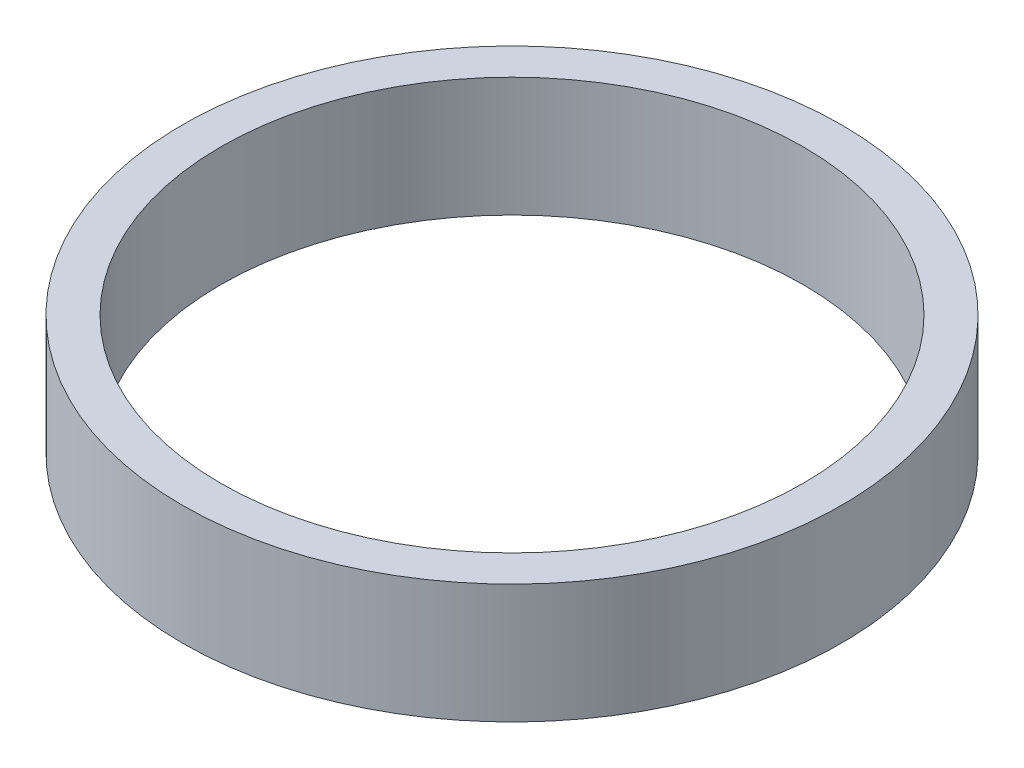
ISO-10303-21;
HEADER;
FILE_DESCRIPTION(('STEP AP214'),'2;1');
FILE_NAME('part.step','',(''),(''),'','','');
FILE_SCHEMA(('AUTOMOTIVE_DESIGN { 1 0 10303 214 1 1 1 1 }'));
ENDSEC;
DATA;
#1=APPLICATION_CONTEXT('core data for automotive mechanical design processes');
#2=APPLICATION_PROTOCOL_DEFINITION('international standard','automotive_design',2000,#1);
#3=PRODUCT_CONTEXT('',#1,'mechanical');
#4=PRODUCT('Part','Part','',(#3));
#5=PRODUCT_RELATED_PRODUCT_CATEGORY('part','',(#4));
#6=PRODUCT_DEFINITION_FORMATION('','',#4);
#7=PRODUCT_DEFINITION_CONTEXT('part definition',#1,'design');
#8=PRODUCT_DEFINITION('design','',#6,#7);
#9=PRODUCT_DEFINITION_SHAPE('','',#8);
#10=(LENGTH_UNIT() NAMED_UNIT(*) SI_UNIT(.MILLI.,.METRE.));
#11=(NAMED_UNIT(*) PLANE_ANGLE_UNIT() SI_UNIT($,.RADIAN.));
#12=(NAMED_UNIT(*) SI_UNIT($,.STERADIAN.) SOLID_ANGLE_UNIT());
#13=UNCERTAINTY_MEASURE_WITH_UNIT(LENGTH_MEASURE(1.E-05),#10,'distance_accuracy_value','');
#14=(GEOMETRIC_REPRESENTATION_CONTEXT(3) GLOBAL_UNCERTAINTY_ASSIGNED_CONTEXT((#13)) GLOBAL_UNIT_ASSIGNED_CONTEXT((#10,
#11,#12)) REPRESENTATION_CONTEXT('',''));
#15=CARTESIAN_POINT('',(0.,0.,0.));
#16=DIRECTION('',(0.,0.,1.));
#17=DIRECTION('',(1.,0.,0.));
#18=AXIS2_PLACEMENT_3D('',#15,#16,#17);
#19=CARTESIAN_POINT('',(0.,12.5,0.));
#20=DIRECTION('',(0.,1.,0.));
#21=DIRECTION('',(0.,0.,1.));
#22=AXIS2_PLACEMENT_3D('',#19,#20,#21);
#23=PLANE('',#22);
#24=CARTESIAN_POINT('',(0.,12.5,0.));
#25=DIRECTION('',(0.,1.,0.));
#26=DIRECTION('',(0.,0.,1.));
#27=AXIS2_PLACEMENT_3D('',#24,#25,#26);
#28=CIRCLE('',#27,34.5);
#29=CARTESIAN_POINT('',(0.,12.5,34.5));
#30=VERTEX_POINT('',#29);
#31=EDGE_CURVE('E10',#30,#30,#28,.T.);
#32=ORIENTED_EDGE('',*,*,#31,.T.);
#33=EDGE_LOOP('',(#32));
#34=FACE_BOUND('',#33,.T.);
#35=CARTESIAN_POINT('',(0.,12.5,0.));
#36=DIRECTION('',(0.,1.,0.));
#37=DIRECTION('',(0.,0.,1.));
#38=AXIS2_PLACEMENT_3D('',#35,#36,#37);
#39=CIRCLE('',#38,30.5);
#40=CARTESIAN_POINT('',(0.,12.5,30.5));
#41=VERTEX_POINT('',#40);
#42=EDGE_CURVE('E48',#41,#41,#39,.T.);
#43=ORIENTED_EDGE('',*,*,#42,.F.);
#44=EDGE_LOOP('',(#43));
#45=FACE_BOUND('',#44,.T.);
#46=ADVANCED_FACE('F37',(#34,#45),#23,.T.);
#47=CARTESIAN_POINT('',(0.,0.,0.));
#48=DIRECTION('',(0.,1.,0.));
#49=DIRECTION('',(0.,0.,1.));
#50=AXIS2_PLACEMENT_3D('',#47,#48,#49);
#51=PLANE('',#50);
#52=CARTESIAN_POINT('',(0.,0.,0.));
#53=DIRECTION('',(0.,1.,0.));
#54=DIRECTION('',(0.,0.,1.));
#55=AXIS2_PLACEMENT_3D('',#52,#53,#54);
#56=CIRCLE('',#55,34.5);
#57=CARTESIAN_POINT('',(0.,0.,34.5));
#58=VERTEX_POINT('',#57);
#59=EDGE_CURVE('E41',#58,#58,#56,.T.);
#60=ORIENTED_EDGE('',*,*,#59,.F.);
#61=EDGE_LOOP('',(#60));
#62=FACE_BOUND('',#61,.T.);
#63=CARTESIAN_POINT('',(0.,0.,0.));
#64=DIRECTION('',(0.,1.,0.));
#65=DIRECTION('',(0.,0.,1.));
#66=AXIS2_PLACEMENT_3D('',#63,#64,#65);
#67=CIRCLE('',#66,30.5);
#68=CARTESIAN_POINT('',(0.,0.,30.5));
#69=VERTEX_POINT('',#68);
#70=EDGE_CURVE('E50',#69,#69,#67,.T.);
#71=ORIENTED_EDGE('',*,*,#70,.T.);
#72=EDGE_LOOP('',(#71));
#73=FACE_BOUND('',#72,.T.);
#74=ADVANCED_FACE('F60',(#62,#73),#51,.F.);
#75=CARTESIAN_POINT('',(0.,12.5,0.));
#76=DIRECTION('',(0.,-1.,0.));
#77=DIRECTION('',(0.,0.,-1.));
#78=AXIS2_PLACEMENT_3D('',#75,#76,#77);
#79=CYLINDRICAL_SURFACE('',#78,34.5);
#80=ORIENTED_EDGE('',*,*,#31,.F.);
#81=EDGE_LOOP('',(#80));
#82=FACE_BOUND('',#81,.T.);
#83=ORIENTED_EDGE('',*,*,#59,.T.);
#84=EDGE_LOOP('',(#83));
#85=FACE_BOUND('',#84,.T.);
#86=ADVANCED_FACE('F39',(#82,#85),#79,.T.);
#87=CARTESIAN_POINT('',(0.,12.5,0.));
#88=DIRECTION('',(0.,-1.,0.));
#89=DIRECTION('',(0.,0.,-1.));
#90=AXIS2_PLACEMENT_3D('',#87,#88,#89);
#91=CYLINDRICAL_SURFACE('',#90,30.5);
#92=ORIENTED_EDGE('',*,*,#42,.T.);
#93=EDGE_LOOP('',(#92));
#94=FACE_BOUND('',#93,.T.);
#95=ORIENTED_EDGE('',*,*,#70,.F.);
#96=EDGE_LOOP('',(#95));
#97=FACE_BOUND('',#96,.T.);
#98=ADVANCED_FACE('F56',(#94,#97),#91,.F.);
#99=CLOSED_SHELL('',(#46,#74,#86,#98));
#100=MANIFOLD_SOLID_BREP('B2',#99);
#101=ADVANCED_BREP_SHAPE_REPRESENTATION('',(#18,#100),#14);
#102=SHAPE_DEFINITION_REPRESENTATION(#9,#101);
ENDSEC;
END-ISO-10303-21;
